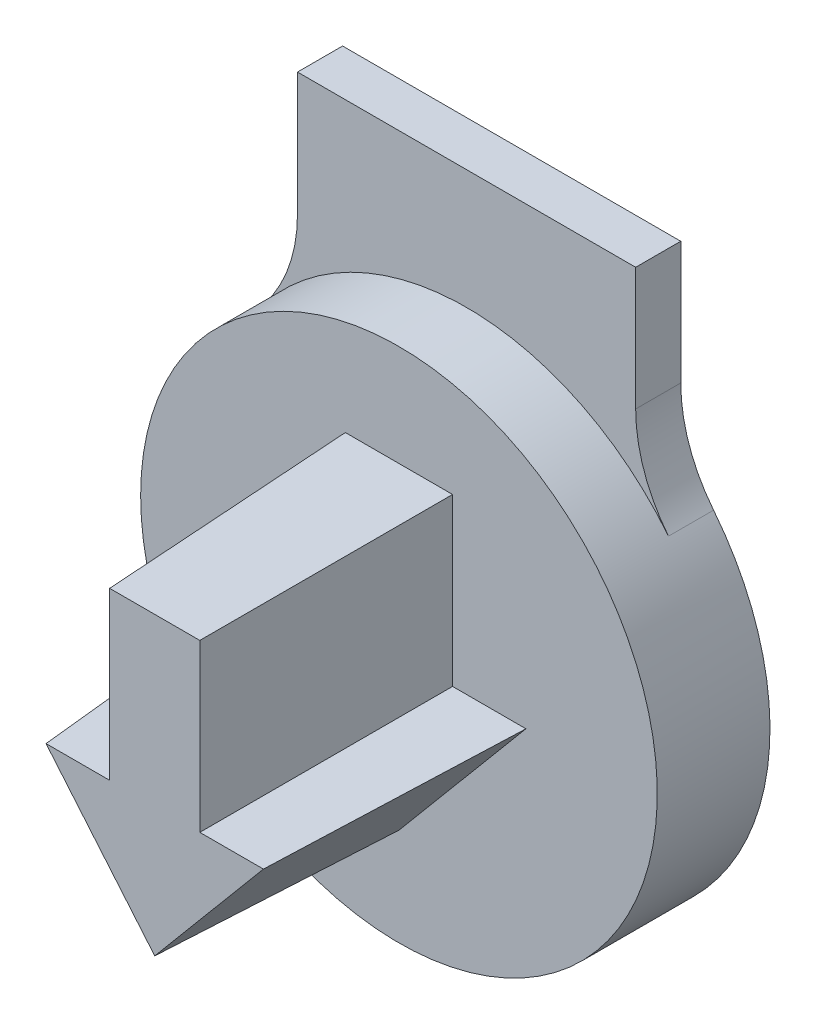
ISO-10303-21;
HEADER;
FILE_DESCRIPTION(('STEP AP214'),'2;1');
FILE_NAME('part.step','',(''),(''),'','','');
FILE_SCHEMA(('AUTOMOTIVE_DESIGN { 1 0 10303 214 1 1 1 1 }'));
ENDSEC;
DATA;
#1=APPLICATION_CONTEXT('core data for automotive mechanical design processes');
#2=APPLICATION_PROTOCOL_DEFINITION('international standard','automotive_design',2000,#1);
#3=PRODUCT_CONTEXT('',#1,'mechanical');
#4=PRODUCT('Part','Part','',(#3));
#5=PRODUCT_RELATED_PRODUCT_CATEGORY('part','',(#4));
#6=PRODUCT_DEFINITION_FORMATION('','',#4);
#7=PRODUCT_DEFINITION_CONTEXT('part definition',#1,'design');
#8=PRODUCT_DEFINITION('design','',#6,#7);
#9=PRODUCT_DEFINITION_SHAPE('','',#8);
#10=(LENGTH_UNIT() NAMED_UNIT(*) SI_UNIT(.MILLI.,.METRE.));
#11=(NAMED_UNIT(*) PLANE_ANGLE_UNIT() SI_UNIT($,.RADIAN.));
#12=(NAMED_UNIT(*) SI_UNIT($,.STERADIAN.) SOLID_ANGLE_UNIT());
#13=UNCERTAINTY_MEASURE_WITH_UNIT(LENGTH_MEASURE(1.E-05),#10,'distance_accuracy_value','');
#14=(GEOMETRIC_REPRESENTATION_CONTEXT(3) GLOBAL_UNCERTAINTY_ASSIGNED_CONTEXT((#13)) GLOBAL_UNIT_ASSIGNED_CONTEXT((#10,
#11,#12)) REPRESENTATION_CONTEXT('',''));
#15=CARTESIAN_POINT('',(0.,0.,0.));
#16=DIRECTION('',(0.,0.,1.));
#17=DIRECTION('',(1.,0.,0.));
#18=AXIS2_PLACEMENT_3D('',#15,#16,#17);
#19=CARTESIAN_POINT('',(0.,0.,9.7));
#20=DIRECTION('',(0.,0.,1.));
#21=DIRECTION('',(1.,0.,0.));
#22=AXIS2_PLACEMENT_3D('',#19,#20,#21);
#23=PLANE('',#22);
#24=DIRECTION('',(1.,0.,0.));
#25=VECTOR('',#24,1.);
#26=CARTESIAN_POINT('',(0.,-0.47473922221737,9.7));
#27=LINE('',#26,#25);
#28=CARTESIAN_POINT('',(1.2,-0.47473922221737,9.7));
#29=VERTEX_POINT('',#28);
#30=CARTESIAN_POINT('',(2.89277465397452,-0.47473922221737,9.7));
#31=VERTEX_POINT('',#30);
#32=EDGE_CURVE('E166',#29,#31,#27,.T.);
#33=ORIENTED_EDGE('',*,*,#32,.F.);
#34=DIRECTION('',(0.,1.,0.));
#35=VECTOR('',#34,1.);
#36=CARTESIAN_POINT('',(1.2,0.,9.7));
#37=LINE('',#36,#35);
#38=CARTESIAN_POINT('',(1.2,3.95,9.7));
#39=VERTEX_POINT('',#38);
#40=EDGE_CURVE('E172',#39,#29,#37,.F.);
#41=ORIENTED_EDGE('',*,*,#40,.F.);
#42=DIRECTION('',(1.,0.,0.));
#43=VECTOR('',#42,1.);
#44=CARTESIAN_POINT('',(0.,3.95,9.7));
#45=LINE('',#44,#43);
#46=CARTESIAN_POINT('',(-1.2,3.95,9.7));
#47=VERTEX_POINT('',#46);
#48=EDGE_CURVE('E175',#47,#39,#45,.T.);
#49=ORIENTED_EDGE('',*,*,#48,.F.);
#50=DIRECTION('',(0.,1.,0.));
#51=VECTOR('',#50,1.);
#52=CARTESIAN_POINT('',(-1.2,0.,9.7));
#53=LINE('',#52,#51);
#54=CARTESIAN_POINT('',(-1.2,-0.47473922221737,9.7));
#55=VERTEX_POINT('',#54);
#56=EDGE_CURVE('E181',#55,#47,#53,.T.);
#57=ORIENTED_EDGE('',*,*,#56,.F.);
#58=DIRECTION('',(1.,0.,0.));
#59=VECTOR('',#58,1.);
#60=CARTESIAN_POINT('',(0.,-0.47473922221737,9.7));
#61=LINE('',#60,#59);
#62=CARTESIAN_POINT('',(-2.89277465397453,-0.474739222217369,9.7));
#63=VERTEX_POINT('',#62);
#64=EDGE_CURVE('E184',#55,#63,#61,.F.);
#65=ORIENTED_EDGE('',*,*,#64,.T.);
#66=DIRECTION('',(0.642787609686539,-0.766044443118978,0.));
#67=VECTOR('',#66,1.);
#68=CARTESIAN_POINT('',(-1.93131328386847,-1.62056426418181,9.7));
#69=LINE('',#68,#67);
#70=CARTESIAN_POINT('',(0.,-3.92221380865698,9.7));
#71=VERTEX_POINT('',#70);
#72=EDGE_CURVE('E151',#71,#63,#69,.F.);
#73=ORIENTED_EDGE('',*,*,#72,.F.);
#74=DIRECTION('',(0.642787609686539,0.766044443118978,0.));
#75=VECTOR('',#74,1.);
#76=CARTESIAN_POINT('',(1.93131328386847,-1.62056426418181,9.7));
#77=LINE('',#76,#75);
#78=EDGE_CURVE('E160',#31,#71,#77,.F.);
#79=ORIENTED_EDGE('',*,*,#78,.F.);
#80=EDGE_LOOP('',(#33,#41,#49,#57,#65,#73,#79));
#81=FACE_BOUND('',#80,.T.);
#82=ADVANCED_FACE('F17',(#81),#23,.T.);
#83=CARTESIAN_POINT('',(-1.2,0.,9.7));
#84=DIRECTION('',(-0.999390827019096,0.,0.0348994967025009));
#85=DIRECTION('',(0.0348994967025009,0.,0.999390827019096));
#86=AXIS2_PLACEMENT_3D('',#83,#84,#85);
#87=PLANE('',#86);
#88=DIRECTION('',(0.0348782627423746,-0.0348782627423746,0.998782765958718));
#89=VECTOR('',#88,1.);
#90=CARTESIAN_POINT('',(-1.42698500169636,4.17698500169636,3.2));
#91=LINE('',#90,#89);
#92=CARTESIAN_POINT('',(-1.42698500169636,4.17698500169636,3.2));
#93=VERTEX_POINT('',#92);
#94=EDGE_CURVE('E178',#93,#47,#91,.T.);
#95=ORIENTED_EDGE('',*,*,#94,.F.);
#96=DIRECTION('',(0.,1.,0.));
#97=VECTOR('',#96,1.);
#98=CARTESIAN_POINT('',(-1.42698500169636,0.,3.2));
#99=LINE('',#98,#97);
#100=CARTESIAN_POINT('',(-1.42698500169636,-0.247754220521009,3.2));
#101=VERTEX_POINT('',#100);
#102=EDGE_CURVE('E131',#101,#93,#99,.T.);
#103=ORIENTED_EDGE('',*,*,#102,.F.);
#104=DIRECTION('',(-0.0348782627423746,0.0348782627423745,-0.998782765958718));
#105=VECTOR('',#104,1.);
#106=CARTESIAN_POINT('',(-1.2,-0.47473922221737,9.7));
#107=LINE('',#106,#105);
#108=EDGE_CURVE('E134',#55,#101,#107,.T.);
#109=ORIENTED_EDGE('',*,*,#108,.F.);
#110=ORIENTED_EDGE('',*,*,#56,.T.);
#111=EDGE_LOOP('',(#95,#103,#109,#110));
#112=FACE_BOUND('',#111,.T.);
#113=ADVANCED_FACE('F233',(#112),#87,.T.);
#114=CARTESIAN_POINT('',(0.,3.95,9.7));
#115=DIRECTION('',(0.,0.999390827019096,0.0348994967025009));
#116=DIRECTION('',(0.,-0.0348994967025009,0.999390827019096));
#117=AXIS2_PLACEMENT_3D('',#114,#115,#116);
#118=PLANE('',#117);
#119=DIRECTION('',(-0.0348782627423745,-0.0348782627423746,0.998782765958718));
#120=VECTOR('',#119,1.);
#121=CARTESIAN_POINT('',(1.42698500169636,4.17698500169636,3.2));
#122=LINE('',#121,#120);
#123=CARTESIAN_POINT('',(1.42698500169636,4.17698500169636,3.2));
#124=VERTEX_POINT('',#123);
#125=EDGE_CURVE('E169',#124,#39,#122,.T.);
#126=ORIENTED_EDGE('',*,*,#125,.F.);
#127=DIRECTION('',(1.,0.,0.));
#128=VECTOR('',#127,1.);
#129=CARTESIAN_POINT('',(0.,4.17698500169636,3.2));
#130=LINE('',#129,#128);
#131=EDGE_CURVE('E128',#93,#124,#130,.T.);
#132=ORIENTED_EDGE('',*,*,#131,.F.);
#133=ORIENTED_EDGE('',*,*,#94,.T.);
#134=ORIENTED_EDGE('',*,*,#48,.T.);
#135=EDGE_LOOP('',(#126,#132,#133,#134));
#136=FACE_BOUND('',#135,.T.);
#137=ADVANCED_FACE('F240',(#136),#118,.T.);
#138=CARTESIAN_POINT('',(1.2,0.,9.7));
#139=DIRECTION('',(0.999390827019096,0.,0.0348994967025009));
#140=DIRECTION('',(0.0348994967025009,0.,-0.999390827019096));
#141=AXIS2_PLACEMENT_3D('',#138,#139,#140);
#142=PLANE('',#141);
#143=DIRECTION('',(0.,1.,0.));
#144=VECTOR('',#143,1.);
#145=CARTESIAN_POINT('',(1.42698500169636,0.,3.2));
#146=LINE('',#145,#144);
#147=CARTESIAN_POINT('',(1.42698500169636,-0.247754220521009,3.2));
#148=VERTEX_POINT('',#147);
#149=EDGE_CURVE('E125',#124,#148,#146,.F.);
#150=ORIENTED_EDGE('',*,*,#149,.F.);
#151=ORIENTED_EDGE('',*,*,#125,.T.);
#152=ORIENTED_EDGE('',*,*,#40,.T.);
#153=DIRECTION('',(-0.0348782627423746,-0.0348782627423745,0.998782765958718));
#154=VECTOR('',#153,1.);
#155=CARTESIAN_POINT('',(1.42698500169636,-0.24775422052101,3.2));
#156=LINE('',#155,#154);
#157=EDGE_CURVE('E163',#148,#29,#156,.T.);
#158=ORIENTED_EDGE('',*,*,#157,.F.);
#159=EDGE_LOOP('',(#150,#151,#152,#158));
#160=FACE_BOUND('',#159,.T.);
#161=ADVANCED_FACE('F247',(#160),#142,.T.);
#162=CARTESIAN_POINT('',(0.,-0.47473922221737,9.7));
#163=DIRECTION('',(0.,0.999390827019096,0.0348994967025009));
#164=DIRECTION('',(0.,-0.0348994967025009,0.999390827019096));
#165=AXIS2_PLACEMENT_3D('',#162,#163,#164);
#166=PLANE('',#165);
#167=DIRECTION('',(1.,0.,0.));
#168=VECTOR('',#167,1.);
#169=CARTESIAN_POINT('',(0.,-0.247754220521009,3.2));
#170=LINE('',#169,#168);
#171=CARTESIAN_POINT('',(3.37954556096424,-0.24775422052101,3.2));
#172=VERTEX_POINT('',#171);
#173=EDGE_CURVE('E122',#148,#172,#170,.T.);
#174=ORIENTED_EDGE('',*,*,#173,.F.);
#175=ORIENTED_EDGE('',*,*,#157,.T.);
#176=ORIENTED_EDGE('',*,*,#32,.T.);
#177=DIRECTION('',(-0.0746334797170773,-0.0348021631468292,0.996603558665943));
#178=VECTOR('',#177,1.);
#179=CARTESIAN_POINT('',(3.37954556096424,-0.247754220521009,3.2));
#180=LINE('',#179,#178);
#181=EDGE_CURVE('E157',#172,#31,#180,.T.);
#182=ORIENTED_EDGE('',*,*,#181,.F.);
#183=EDGE_LOOP('',(#174,#175,#176,#182));
#184=FACE_BOUND('',#183,.T.);
#185=ADVANCED_FACE('F251',(#184),#166,.T.);
#186=CARTESIAN_POINT('',(1.93131328386847,-1.62056426418181,9.7));
#187=DIRECTION('',(0.765577789542058,-0.642396040842258,0.0348994967025009));
#188=DIRECTION('',(0.642787609686539,0.766044443118978,0.));
#189=AXIS2_PLACEMENT_3D('',#186,#187,#188);
#190=PLANE('',#189);
#191=DIRECTION('',(-0.642787609686539,-0.766044443118978,0.));
#192=VECTOR('',#191,1.);
#193=CARTESIAN_POINT('',(3.37954556096424,-0.247754220521009,3.2));
#194=LINE('',#193,#192);
#195=CARTESIAN_POINT('',(0.,-4.27533978413596,3.2));
#196=VERTEX_POINT('',#195);
#197=EDGE_CURVE('E119',#172,#196,#194,.T.);
#198=ORIENTED_EDGE('',*,*,#197,.F.);
#199=ORIENTED_EDGE('',*,*,#181,.T.);
#200=ORIENTED_EDGE('',*,*,#78,.T.);
#201=DIRECTION('',(0.,0.0542470788797157,0.998527543151924));
#202=VECTOR('',#201,1.);
#203=CARTESIAN_POINT('',(0.,-4.27533978413596,3.2));
#204=LINE('',#203,#202);
#205=EDGE_CURVE('E154',#196,#71,#204,.T.);
#206=ORIENTED_EDGE('',*,*,#205,.F.);
#207=EDGE_LOOP('',(#198,#199,#200,#206));
#208=FACE_BOUND('',#207,.T.);
#209=ADVANCED_FACE('F366',(#208),#190,.T.);
#210=CARTESIAN_POINT('',(-1.93131328386847,-1.62056426418181,9.7));
#211=DIRECTION('',(-0.765577789542058,-0.642396040842258,0.0348994967025009));
#212=DIRECTION('',(0.642787609686539,-0.766044443118978,0.));
#213=AXIS2_PLACEMENT_3D('',#210,#211,#212);
#214=PLANE('',#213);
#215=DIRECTION('',(0.074633479717076,-0.0348021631468288,0.996603558665943));
#216=VECTOR('',#215,1.);
#217=CARTESIAN_POINT('',(-3.37954556096424,-0.24775422052101,3.2));
#218=LINE('',#217,#216);
#219=CARTESIAN_POINT('',(-3.37954556096424,-0.247754220521009,3.2));
#220=VERTEX_POINT('',#219);
#221=EDGE_CURVE('E148',#220,#63,#218,.T.);
#222=ORIENTED_EDGE('',*,*,#221,.F.);
#223=DIRECTION('',(-0.642787609686539,0.766044443118978,0.));
#224=VECTOR('',#223,1.);
#225=CARTESIAN_POINT('',(0.,-4.27533978413596,3.2));
#226=LINE('',#225,#224);
#227=EDGE_CURVE('E116',#196,#220,#226,.T.);
#228=ORIENTED_EDGE('',*,*,#227,.F.);
#229=ORIENTED_EDGE('',*,*,#205,.T.);
#230=ORIENTED_EDGE('',*,*,#72,.T.);
#231=EDGE_LOOP('',(#222,#228,#229,#230));
#232=FACE_BOUND('',#231,.T.);
#233=ADVANCED_FACE('F357',(#232),#214,.T.);
#234=CARTESIAN_POINT('',(0.,-0.47473922221737,9.7));
#235=DIRECTION('',(0.,0.999390827019096,0.0348994967025009));
#236=DIRECTION('',(0.,-0.0348994967025009,0.999390827019096));
#237=AXIS2_PLACEMENT_3D('',#234,#235,#236);
#238=PLANE('',#237);
#239=ORIENTED_EDGE('',*,*,#108,.T.);
#240=DIRECTION('',(1.,0.,0.));
#241=VECTOR('',#240,1.);
#242=CARTESIAN_POINT('',(0.,-0.247754220521009,3.2));
#243=LINE('',#242,#241);
#244=EDGE_CURVE('E68',#220,#101,#243,.T.);
#245=ORIENTED_EDGE('',*,*,#244,.F.);
#246=ORIENTED_EDGE('',*,*,#221,.T.);
#247=ORIENTED_EDGE('',*,*,#64,.F.);
#248=EDGE_LOOP('',(#239,#245,#246,#247));
#249=FACE_BOUND('',#248,.T.);
#250=ADVANCED_FACE('F271',(#249),#238,.T.);
#251=CARTESIAN_POINT('',(0.,0.,3.2));
#252=DIRECTION('',(0.,0.,1.));
#253=DIRECTION('',(1.,0.,0.));
#254=AXIS2_PLACEMENT_3D('',#251,#252,#253);
#255=PLANE('',#254);
#256=ORIENTED_EDGE('',*,*,#227,.T.);
#257=ORIENTED_EDGE('',*,*,#244,.T.);
#258=ORIENTED_EDGE('',*,*,#102,.T.);
#259=ORIENTED_EDGE('',*,*,#131,.T.);
#260=ORIENTED_EDGE('',*,*,#149,.T.);
#261=ORIENTED_EDGE('',*,*,#173,.T.);
#262=ORIENTED_EDGE('',*,*,#197,.T.);
#263=EDGE_LOOP('',(#256,#257,#258,#259,#260,#261,#262));
#264=FACE_BOUND('',#263,.T.);
#265=CARTESIAN_POINT('',(0.,0.,3.2));
#266=DIRECTION('',(0.,0.,-1.));
#267=DIRECTION('',(-1.,0.,0.));
#268=AXIS2_PLACEMENT_3D('',#265,#266,#267);
#269=CIRCLE('',#268,6.875);
#270=CARTESIAN_POINT('',(-6.875,0.,3.2));
#271=VERTEX_POINT('',#270);
#272=EDGE_CURVE('E73',#271,#271,#269,.T.);
#273=ORIENTED_EDGE('',*,*,#272,.F.);
#274=EDGE_LOOP('',(#273));
#275=FACE_BOUND('',#274,.T.);
#276=ADVANCED_FACE('F258',(#264,#275),#255,.T.);
#277=CARTESIAN_POINT('',(0.,1.5875,1.4));
#278=DIRECTION('',(0.,0.,-1.));
#279=DIRECTION('',(-1.,0.,0.));
#280=AXIS2_PLACEMENT_3D('',#277,#278,#279);
#281=PLANE('',#280);
#282=DIRECTION('',(0.,1.,0.));
#283=VECTOR('',#282,1.);
#284=CARTESIAN_POINT('',(4.5,8.41674088780378,1.4));
#285=LINE('',#284,#283);
#286=CARTESIAN_POINT('',(4.5,10.05,1.4));
#287=VERTEX_POINT('',#286);
#288=CARTESIAN_POINT('',(4.5,6.78348177560757,1.4));
#289=VERTEX_POINT('',#288);
#290=EDGE_CURVE('E67',#287,#289,#285,.F.);
#291=ORIENTED_EDGE('',*,*,#290,.F.);
#292=DIRECTION('',(1.,0.,0.));
#293=VECTOR('',#292,1.);
#294=CARTESIAN_POINT('',(0.,10.05,1.4));
#295=LINE('',#294,#293);
#296=CARTESIAN_POINT('',(-4.5,10.05,1.4));
#297=VERTEX_POINT('',#296);
#298=EDGE_CURVE('E110',#297,#287,#295,.T.);
#299=ORIENTED_EDGE('',*,*,#298,.F.);
#300=DIRECTION('',(0.,1.,0.));
#301=VECTOR('',#300,1.);
#302=CARTESIAN_POINT('',(-4.5,8.41674088780378,1.4));
#303=LINE('',#302,#301);
#304=CARTESIAN_POINT('',(-4.5,6.78348177560757,1.4));
#305=VERTEX_POINT('',#304);
#306=EDGE_CURVE('E95',#305,#297,#303,.T.);
#307=ORIENTED_EDGE('',*,*,#306,.F.);
#308=CARTESIAN_POINT('',(-8.5,6.78348177560757,1.4));
#309=DIRECTION('',(0.,0.,-1.));
#310=DIRECTION('',(-1.,0.,0.));
#311=AXIS2_PLACEMENT_3D('',#308,#309,#310);
#312=CIRCLE('',#311,4.);
#313=CARTESIAN_POINT('',(-5.37356321839081,4.28840801906225,1.4));
#314=VERTEX_POINT('',#313);
#315=EDGE_CURVE('E77',#305,#314,#312,.T.);
#316=ORIENTED_EDGE('',*,*,#315,.T.);
#317=CARTESIAN_POINT('',(0.,0.,1.4));
#318=DIRECTION('',(0.,0.,-1.));
#319=DIRECTION('',(-1.,0.,0.));
#320=AXIS2_PLACEMENT_3D('',#317,#318,#319);
#321=CIRCLE('',#320,6.875);
#322=CARTESIAN_POINT('',(5.37356321839081,4.28840801906225,1.4));
#323=VERTEX_POINT('',#322);
#324=EDGE_CURVE('E71',#323,#314,#321,.F.);
#325=ORIENTED_EDGE('',*,*,#324,.F.);
#326=CARTESIAN_POINT('',(8.5,6.78348177560757,1.4));
#327=DIRECTION('',(0.,0.,-1.));
#328=DIRECTION('',(-1.,0.,0.));
#329=AXIS2_PLACEMENT_3D('',#326,#327,#328);
#330=CIRCLE('',#329,4.);
#331=EDGE_CURVE('E20',#323,#289,#330,.T.);
#332=ORIENTED_EDGE('',*,*,#331,.T.);
#333=EDGE_LOOP('',(#291,#299,#307,#316,#325,#332));
#334=FACE_BOUND('',#333,.T.);
#335=ADVANCED_FACE('F75',(#334),#281,.F.);
#336=CARTESIAN_POINT('',(8.5,6.78348177560757,1.4));
#337=DIRECTION('',(0.,0.,-1.));
#338=DIRECTION('',(-1.,0.,0.));
#339=AXIS2_PLACEMENT_3D('',#336,#337,#338);
#340=CYLINDRICAL_SURFACE('',#339,4.);
#341=DIRECTION('',(0.,0.,-1.));
#342=VECTOR('',#341,1.);
#343=CARTESIAN_POINT('',(4.5,6.78348177560757,1.4));
#344=LINE('',#343,#342);
#345=CARTESIAN_POINT('',(4.5,6.78348177560757,0.2));
#346=VERTEX_POINT('',#345);
#347=EDGE_CURVE('E63',#289,#346,#344,.T.);
#348=ORIENTED_EDGE('',*,*,#347,.F.);
#349=ORIENTED_EDGE('',*,*,#331,.F.);
#350=DIRECTION('',(0.,0.,-1.));
#351=VECTOR('',#350,1.);
#352=CARTESIAN_POINT('',(5.37356321839081,4.28840801906225,3.2));
#353=LINE('',#352,#351);
#354=CARTESIAN_POINT('',(5.37356321839081,4.28840801906225,0.2));
#355=VERTEX_POINT('',#354);
#356=EDGE_CURVE('E62',#355,#323,#353,.F.);
#357=ORIENTED_EDGE('',*,*,#356,.F.);
#358=CARTESIAN_POINT('',(8.5,6.78348177560757,0.2));
#359=DIRECTION('',(0.,0.,-1.));
#360=DIRECTION('',(-1.,0.,0.));
#361=AXIS2_PLACEMENT_3D('',#358,#359,#360);
#362=CIRCLE('',#361,4.);
#363=EDGE_CURVE('E79',#355,#346,#362,.T.);
#364=ORIENTED_EDGE('',*,*,#363,.T.);
#365=EDGE_LOOP('',(#348,#349,#357,#364));
#366=FACE_BOUND('',#365,.T.);
#367=ADVANCED_FACE('F60',(#366),#340,.F.);
#368=CARTESIAN_POINT('',(4.5,8.41674088780378,1.4));
#369=DIRECTION('',(1.,0.,0.));
#370=DIRECTION('',(0.,0.,-1.));
#371=AXIS2_PLACEMENT_3D('',#368,#369,#370);
#372=PLANE('',#371);
#373=ORIENTED_EDGE('',*,*,#290,.T.);
#374=ORIENTED_EDGE('',*,*,#347,.T.);
#375=DIRECTION('',(0.,1.,0.));
#376=VECTOR('',#375,1.);
#377=CARTESIAN_POINT('',(4.5,0.,0.2));
#378=LINE('',#377,#376);
#379=CARTESIAN_POINT('',(4.5,10.05,0.2));
#380=VERTEX_POINT('',#379);
#381=EDGE_CURVE('E104',#346,#380,#378,.T.);
#382=ORIENTED_EDGE('',*,*,#381,.T.);
#383=DIRECTION('',(0.,0.,1.));
#384=VECTOR('',#383,1.);
#385=CARTESIAN_POINT('',(4.5,10.05,1.4));
#386=LINE('',#385,#384);
#387=EDGE_CURVE('E107',#287,#380,#386,.F.);
#388=ORIENTED_EDGE('',*,*,#387,.F.);
#389=EDGE_LOOP('',(#373,#374,#382,#388));
#390=FACE_BOUND('',#389,.T.);
#391=ADVANCED_FACE('F272',(#390),#372,.T.);
#392=CARTESIAN_POINT('',(0.,10.05,1.4));
#393=DIRECTION('',(0.,1.,0.));
#394=DIRECTION('',(0.,0.,1.));
#395=AXIS2_PLACEMENT_3D('',#392,#393,#394);
#396=PLANE('',#395);
#397=ORIENTED_EDGE('',*,*,#298,.T.);
#398=ORIENTED_EDGE('',*,*,#387,.T.);
#399=DIRECTION('',(1.,0.,0.));
#400=VECTOR('',#399,1.);
#401=CARTESIAN_POINT('',(0.,10.05,0.2));
#402=LINE('',#401,#400);
#403=CARTESIAN_POINT('',(-4.5,10.05,0.2));
#404=VERTEX_POINT('',#403);
#405=EDGE_CURVE('E100',#380,#404,#402,.F.);
#406=ORIENTED_EDGE('',*,*,#405,.T.);
#407=DIRECTION('',(0.,0.,1.));
#408=VECTOR('',#407,1.);
#409=CARTESIAN_POINT('',(-4.5,10.05,1.4));
#410=LINE('',#409,#408);
#411=EDGE_CURVE('E89',#297,#404,#410,.F.);
#412=ORIENTED_EDGE('',*,*,#411,.F.);
#413=EDGE_LOOP('',(#397,#398,#406,#412));
#414=FACE_BOUND('',#413,.T.);
#415=ADVANCED_FACE('F206',(#414),#396,.T.);
#416=CARTESIAN_POINT('',(-4.5,8.41674088780378,1.4));
#417=DIRECTION('',(-1.,0.,0.));
#418=DIRECTION('',(0.,0.,1.));
#419=AXIS2_PLACEMENT_3D('',#416,#417,#418);
#420=PLANE('',#419);
#421=ORIENTED_EDGE('',*,*,#306,.T.);
#422=ORIENTED_EDGE('',*,*,#411,.T.);
#423=DIRECTION('',(0.,1.,0.));
#424=VECTOR('',#423,1.);
#425=CARTESIAN_POINT('',(-4.5,0.,0.2));
#426=LINE('',#425,#424);
#427=CARTESIAN_POINT('',(-4.5,6.78348177560757,0.2));
#428=VERTEX_POINT('',#427);
#429=EDGE_CURVE('E103',#404,#428,#426,.F.);
#430=ORIENTED_EDGE('',*,*,#429,.T.);
#431=DIRECTION('',(0.,0.,-1.));
#432=VECTOR('',#431,1.);
#433=CARTESIAN_POINT('',(-4.5,6.78348177560757,1.4));
#434=LINE('',#433,#432);
#435=EDGE_CURVE('E87',#428,#305,#434,.F.);
#436=ORIENTED_EDGE('',*,*,#435,.T.);
#437=EDGE_LOOP('',(#421,#422,#430,#436));
#438=FACE_BOUND('',#437,.T.);
#439=ADVANCED_FACE('F276',(#438),#420,.T.);
#440=CARTESIAN_POINT('',(-8.5,6.78348177560757,1.4));
#441=DIRECTION('',(0.,0.,-1.));
#442=DIRECTION('',(-1.,0.,0.));
#443=AXIS2_PLACEMENT_3D('',#440,#441,#442);
#444=CYLINDRICAL_SURFACE('',#443,4.);
#445=DIRECTION('',(0.,0.,-1.));
#446=VECTOR('',#445,1.);
#447=CARTESIAN_POINT('',(-5.37356321839081,4.28840801906225,3.2));
#448=LINE('',#447,#446);
#449=CARTESIAN_POINT('',(-5.37356321839081,4.28840801906225,0.2));
#450=VERTEX_POINT('',#449);
#451=EDGE_CURVE('E34',#314,#450,#448,.T.);
#452=ORIENTED_EDGE('',*,*,#451,.F.);
#453=ORIENTED_EDGE('',*,*,#315,.F.);
#454=ORIENTED_EDGE('',*,*,#435,.F.);
#455=CARTESIAN_POINT('',(-8.5,6.78348177560757,0.2));
#456=DIRECTION('',(0.,0.,-1.));
#457=DIRECTION('',(-1.,0.,0.));
#458=AXIS2_PLACEMENT_3D('',#455,#456,#457);
#459=CIRCLE('',#458,4.);
#460=EDGE_CURVE('E26',#428,#450,#459,.T.);
#461=ORIENTED_EDGE('',*,*,#460,.T.);
#462=EDGE_LOOP('',(#452,#453,#454,#461));
#463=FACE_BOUND('',#462,.T.);
#464=ADVANCED_FACE('F274',(#463),#444,.F.);
#465=CARTESIAN_POINT('',(0.,0.,3.2));
#466=DIRECTION('',(0.,0.,-1.));
#467=DIRECTION('',(-1.,0.,0.));
#468=AXIS2_PLACEMENT_3D('',#465,#466,#467);
#469=CYLINDRICAL_SURFACE('',#468,6.875);
#470=ORIENTED_EDGE('',*,*,#451,.T.);
#471=CARTESIAN_POINT('',(0.,0.,0.2));
#472=DIRECTION('',(0.,0.,-1.));
#473=DIRECTION('',(-1.,0.,0.));
#474=AXIS2_PLACEMENT_3D('',#471,#472,#473);
#475=CIRCLE('',#474,6.875);
#476=EDGE_CURVE('E11',#450,#355,#475,.F.);
#477=ORIENTED_EDGE('',*,*,#476,.T.);
#478=ORIENTED_EDGE('',*,*,#356,.T.);
#479=ORIENTED_EDGE('',*,*,#324,.T.);
#480=EDGE_LOOP('',(#470,#477,#478,#479));
#481=FACE_BOUND('',#480,.T.);
#482=ORIENTED_EDGE('',*,*,#272,.T.);
#483=EDGE_LOOP('',(#482));
#484=FACE_BOUND('',#483,.T.);
#485=ADVANCED_FACE('F69',(#481,#484),#469,.T.);
#486=CARTESIAN_POINT('',(0.,0.,0.2));
#487=DIRECTION('',(0.,0.,1.));
#488=DIRECTION('',(1.,0.,0.));
#489=AXIS2_PLACEMENT_3D('',#486,#487,#488);
#490=PLANE('',#489);
#491=ORIENTED_EDGE('',*,*,#460,.F.);
#492=ORIENTED_EDGE('',*,*,#429,.F.);
#493=ORIENTED_EDGE('',*,*,#405,.F.);
#494=ORIENTED_EDGE('',*,*,#381,.F.);
#495=ORIENTED_EDGE('',*,*,#363,.F.);
#496=ORIENTED_EDGE('',*,*,#476,.F.);
#497=EDGE_LOOP('',(#491,#492,#493,#494,#495,#496));
#498=FACE_BOUND('',#497,.T.);
#499=ADVANCED_FACE('F201',(#498),#490,.F.);
#500=CLOSED_SHELL('',(#82,#113,#137,#161,#185,#209,#233,#250,#276,#335,#367,#391,#415,#439,#464,
#485,#499));
#501=MANIFOLD_SOLID_BREP('B1',#500);
#502=ADVANCED_BREP_SHAPE_REPRESENTATION('',(#18,#501),#14);
#503=SHAPE_DEFINITION_REPRESENTATION(#9,#502);
ENDSEC;
END-ISO-10303-21;
